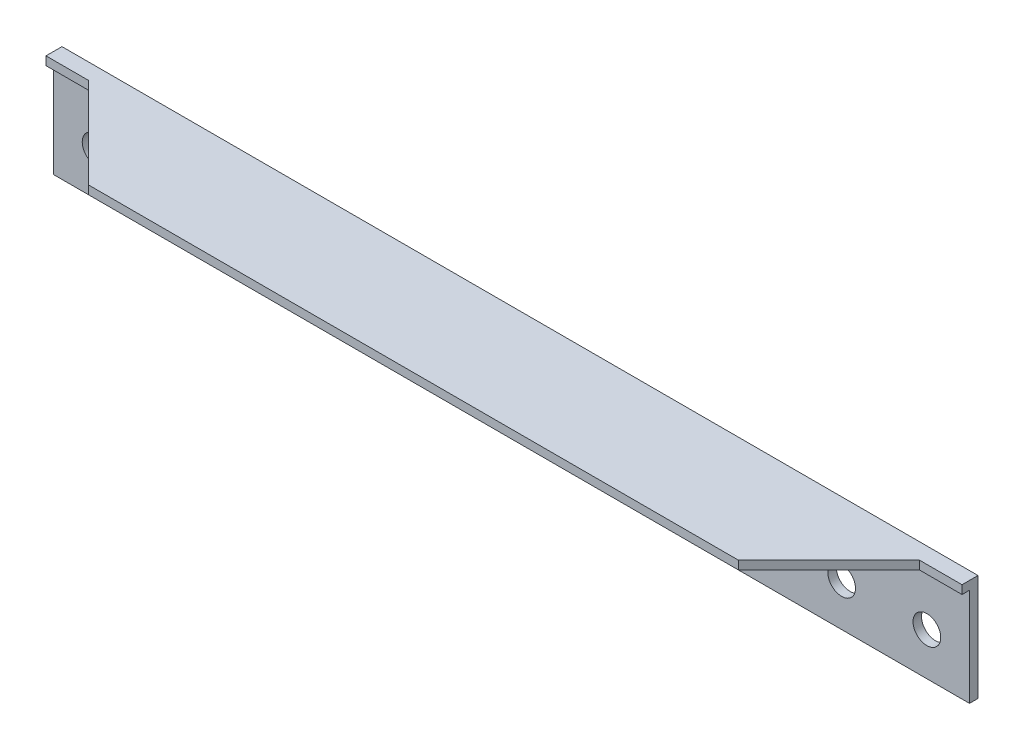
ISO-10303-21;
HEADER;
FILE_DESCRIPTION(('STEP AP214'),'2;1');
FILE_NAME('part.step','',(''),(''),'','','');
FILE_SCHEMA(('AUTOMOTIVE_DESIGN { 1 0 10303 214 1 1 1 1 }'));
ENDSEC;
DATA;
#1=APPLICATION_CONTEXT('core data for automotive mechanical design processes');
#2=APPLICATION_PROTOCOL_DEFINITION('international standard','automotive_design',2000,#1);
#3=PRODUCT_CONTEXT('',#1,'mechanical');
#4=PRODUCT('Part','Part','',(#3));
#5=PRODUCT_RELATED_PRODUCT_CATEGORY('part','',(#4));
#6=PRODUCT_DEFINITION_FORMATION('','',#4);
#7=PRODUCT_DEFINITION_CONTEXT('part definition',#1,'design');
#8=PRODUCT_DEFINITION('design','',#6,#7);
#9=PRODUCT_DEFINITION_SHAPE('','',#8);
#10=(LENGTH_UNIT() NAMED_UNIT(*) SI_UNIT(.MILLI.,.METRE.));
#11=(NAMED_UNIT(*) PLANE_ANGLE_UNIT() SI_UNIT($,.RADIAN.));
#12=(NAMED_UNIT(*) SI_UNIT($,.STERADIAN.) SOLID_ANGLE_UNIT());
#13=UNCERTAINTY_MEASURE_WITH_UNIT(LENGTH_MEASURE(1.E-05),#10,'distance_accuracy_value','');
#14=(GEOMETRIC_REPRESENTATION_CONTEXT(3) GLOBAL_UNCERTAINTY_ASSIGNED_CONTEXT((#13)) GLOBAL_UNIT_ASSIGNED_CONTEXT((#10,
#11,#12)) REPRESENTATION_CONTEXT('',''));
#15=CARTESIAN_POINT('',(0.,0.,0.));
#16=DIRECTION('',(0.,0.,1.));
#17=DIRECTION('',(1.,0.,0.));
#18=AXIS2_PLACEMENT_3D('',#15,#16,#17);
#19=CARTESIAN_POINT('',(430.,0.,8.));
#20=DIRECTION('',(-1.,0.,0.));
#21=DIRECTION('',(0.,0.,1.));
#22=AXIS2_PLACEMENT_3D('',#19,#20,#21);
#23=PLANE('',#22);
#24=DIRECTION('',(0.,1.,0.));
#25=VECTOR('',#24,1.);
#26=CARTESIAN_POINT('',(430.000000000004,-2.50000062179678E-05,15.));
#27=LINE('',#26,#25);
#28=CARTESIAN_POINT('',(430.000000000004,91.9999999999969,15.));
#29=VERTEX_POINT('',#28);
#30=CARTESIAN_POINT('',(430.000000000004,99.9999999999969,15.));
#31=VERTEX_POINT('',#30);
#32=EDGE_CURVE('E112',#29,#31,#27,.T.);
#33=ORIENTED_EDGE('',*,*,#32,.F.);
#34=DIRECTION('',(0.,0.,-1.));
#35=VECTOR('',#34,1.);
#36=CARTESIAN_POINT('',(429.999999999999,91.9999999999969,100.));
#37=LINE('',#36,#35);
#38=CARTESIAN_POINT('',(429.999999999999,91.9999999999969,8.));
#39=VERTEX_POINT('',#38);
#40=EDGE_CURVE('E195',#29,#39,#37,.T.);
#41=ORIENTED_EDGE('',*,*,#40,.T.);
#42=DIRECTION('',(0.,1.,0.));
#43=VECTOR('',#42,1.);
#44=CARTESIAN_POINT('',(430.,0.,8.));
#45=LINE('',#44,#43);
#46=CARTESIAN_POINT('',(430.,0.,8.));
#47=VERTEX_POINT('',#46);
#48=EDGE_CURVE('E139',#47,#39,#45,.T.);
#49=ORIENTED_EDGE('',*,*,#48,.F.);
#50=DIRECTION('',(0.,0.,-1.));
#51=VECTOR('',#50,1.);
#52=CARTESIAN_POINT('',(430.,0.,8.));
#53=LINE('',#52,#51);
#54=CARTESIAN_POINT('',(430.,0.,0.));
#55=VERTEX_POINT('',#54);
#56=EDGE_CURVE('E134',#47,#55,#53,.T.);
#57=ORIENTED_EDGE('',*,*,#56,.T.);
#58=DIRECTION('',(0.,1.,0.));
#59=VECTOR('',#58,1.);
#60=CARTESIAN_POINT('',(430.,0.,0.));
#61=LINE('',#60,#59);
#62=CARTESIAN_POINT('',(430.,100.,0.));
#63=VERTEX_POINT('',#62);
#64=EDGE_CURVE('E132',#55,#63,#61,.T.);
#65=ORIENTED_EDGE('',*,*,#64,.T.);
#66=DIRECTION('',(0.,0.,-1.));
#67=VECTOR('',#66,1.);
#68=CARTESIAN_POINT('',(430.,100.,8.));
#69=LINE('',#68,#67);
#70=EDGE_CURVE('E126',#31,#63,#69,.T.);
#71=ORIENTED_EDGE('',*,*,#70,.F.);
#72=EDGE_LOOP('',(#33,#41,#49,#57,#65,#71));
#73=FACE_BOUND('',#72,.T.);
#74=ADVANCED_FACE('F34',(#73),#23,.F.);
#75=CARTESIAN_POINT('',(430.,100.,8.));
#76=DIRECTION('',(0.,-1.,0.));
#77=DIRECTION('',(1.,0.,0.));
#78=AXIS2_PLACEMENT_3D('',#75,#76,#77);
#79=PLANE('',#78);
#80=DIRECTION('',(0.707106781186499,0.,-0.707106781186596));
#81=VECTOR('',#80,1.);
#82=CARTESIAN_POINT('',(389.999999999994,99.999999999997,14.9999999999932));
#83=LINE('',#82,#81);
#84=CARTESIAN_POINT('',(304.999999999999,99.9999999999969,100.));
#85=VERTEX_POINT('',#84);
#86=CARTESIAN_POINT('',(389.999999999994,99.999999999997,14.9999999999932));
#87=VERTEX_POINT('',#86);
#88=EDGE_CURVE('E49',#85,#87,#83,.T.);
#89=ORIENTED_EDGE('',*,*,#88,.T.);
#90=DIRECTION('',(1.,0.,1.70523317688477E-13));
#91=VECTOR('',#90,1.);
#92=CARTESIAN_POINT('',(430.000000000004,99.9999999999969,15.));
#93=LINE('',#92,#91);
#94=EDGE_CURVE('E116',#87,#31,#93,.T.);
#95=ORIENTED_EDGE('',*,*,#94,.T.);
#96=ORIENTED_EDGE('',*,*,#70,.T.);
#97=DIRECTION('',(-1.,0.,0.));
#98=VECTOR('',#97,1.);
#99=CARTESIAN_POINT('',(430.,100.,0.));
#100=LINE('',#99,#98);
#101=CARTESIAN_POINT('',(-430.000000000001,99.9999999999969,0.));
#102=VERTEX_POINT('',#101);
#103=EDGE_CURVE('E150',#63,#102,#100,.T.);
#104=ORIENTED_EDGE('',*,*,#103,.T.);
#105=DIRECTION('',(0.,0.,-1.));
#106=VECTOR('',#105,1.);
#107=CARTESIAN_POINT('',(-430.000000000001,99.9999999999969,8.));
#108=LINE('',#107,#106);
#109=CARTESIAN_POINT('',(-430.000000000004,99.9999999999969,15.));
#110=VERTEX_POINT('',#109);
#111=EDGE_CURVE('E135',#110,#102,#108,.T.);
#112=ORIENTED_EDGE('',*,*,#111,.F.);
#113=DIRECTION('',(-1.,0.,1.70523317688477E-13));
#114=VECTOR('',#113,1.);
#115=CARTESIAN_POINT('',(-430.000000000004,99.9999999999969,15.));
#116=LINE('',#115,#114);
#117=CARTESIAN_POINT('',(-389.999999999994,99.999999999997,14.9999999999932));
#118=VERTEX_POINT('',#117);
#119=EDGE_CURVE('E185',#118,#110,#116,.T.);
#120=ORIENTED_EDGE('',*,*,#119,.F.);
#121=DIRECTION('',(-0.707106781186499,0.,-0.707106781186596));
#122=VECTOR('',#121,1.);
#123=CARTESIAN_POINT('',(-389.999999999994,99.999999999997,14.9999999999932));
#124=LINE('',#123,#122);
#125=CARTESIAN_POINT('',(-304.999999999999,99.9999999999974,100.));
#126=VERTEX_POINT('',#125);
#127=EDGE_CURVE('E214',#126,#118,#124,.T.);
#128=ORIENTED_EDGE('',*,*,#127,.F.);
#129=DIRECTION('',(-1.,0.,0.));
#130=VECTOR('',#129,1.);
#131=CARTESIAN_POINT('',(-430.000000000001,99.9999999999969,100.));
#132=LINE('',#131,#130);
#133=EDGE_CURVE('E193',#85,#126,#132,.T.);
#134=ORIENTED_EDGE('',*,*,#133,.F.);
#135=EDGE_LOOP('',(#89,#95,#96,#104,#112,#120,#128,#134));
#136=FACE_BOUND('',#135,.T.);
#137=ADVANCED_FACE('F124',(#136),#79,.F.);
#138=CARTESIAN_POINT('',(-430.000000000001,91.9999999999969,100.));
#139=DIRECTION('',(0.,1.,0.));
#140=DIRECTION('',(0.,0.,1.));
#141=AXIS2_PLACEMENT_3D('',#138,#139,#140);
#142=PLANE('',#141);
#143=DIRECTION('',(0.707106781186499,0.,-0.707106781186596));
#144=VECTOR('',#143,1.);
#145=CARTESIAN_POINT('',(-62.4999999999507,91.9999999999969,467.5));
#146=LINE('',#145,#144);
#147=CARTESIAN_POINT('',(304.999999999999,91.9999999999969,100.));
#148=VERTEX_POINT('',#147);
#149=CARTESIAN_POINT('',(389.999999999994,91.9999999999969,14.9999999999932));
#150=VERTEX_POINT('',#149);
#151=EDGE_CURVE('E217',#148,#150,#146,.T.);
#152=ORIENTED_EDGE('',*,*,#151,.F.);
#153=DIRECTION('',(1.,0.,0.));
#154=VECTOR('',#153,1.);
#155=CARTESIAN_POINT('',(-430.000000000001,91.9999999999969,100.));
#156=LINE('',#155,#154);
#157=CARTESIAN_POINT('',(-304.999999999999,91.9999999999969,100.));
#158=VERTEX_POINT('',#157);
#159=EDGE_CURVE('E190',#158,#148,#156,.T.);
#160=ORIENTED_EDGE('',*,*,#159,.F.);
#161=DIRECTION('',(-0.707106781186499,0.,-0.707106781186596));
#162=VECTOR('',#161,1.);
#163=CARTESIAN_POINT('',(-367.499999999991,91.9999999999969,37.4999999999989));
#164=LINE('',#163,#162);
#165=CARTESIAN_POINT('',(-389.999999999994,91.9999999999969,14.9999999999932));
#166=VERTEX_POINT('',#165);
#167=EDGE_CURVE('E57',#158,#166,#164,.T.);
#168=ORIENTED_EDGE('',*,*,#167,.T.);
#169=DIRECTION('',(-1.,0.,1.70523317688477E-13));
#170=VECTOR('',#169,1.);
#171=CARTESIAN_POINT('',(-430.000000000015,91.9999999999969,15.));
#172=LINE('',#171,#170);
#173=CARTESIAN_POINT('',(-430.000000000004,91.9999999999969,15.));
#174=VERTEX_POINT('',#173);
#175=EDGE_CURVE('E208',#166,#174,#172,.T.);
#176=ORIENTED_EDGE('',*,*,#175,.T.);
#177=DIRECTION('',(0.,0.,-1.));
#178=VECTOR('',#177,1.);
#179=CARTESIAN_POINT('',(-430.000000000001,91.9999999999969,100.));
#180=LINE('',#179,#178);
#181=CARTESIAN_POINT('',(-430.000000000001,91.9999999999969,8.));
#182=VERTEX_POINT('',#181);
#183=EDGE_CURVE('E178',#174,#182,#180,.T.);
#184=ORIENTED_EDGE('',*,*,#183,.T.);
#185=DIRECTION('',(1.,0.,0.));
#186=VECTOR('',#185,1.);
#187=CARTESIAN_POINT('',(-430.000000000001,91.9999999999969,8.));
#188=LINE('',#187,#186);
#189=EDGE_CURVE('E183',#182,#39,#188,.T.);
#190=ORIENTED_EDGE('',*,*,#189,.T.);
#191=ORIENTED_EDGE('',*,*,#40,.F.);
#192=DIRECTION('',(1.,0.,1.70523317688477E-13));
#193=VECTOR('',#192,1.);
#194=CARTESIAN_POINT('',(-429.999999999986,91.9999999999969,14.9999999998534));
#195=LINE('',#194,#193);
#196=EDGE_CURVE('E11',#150,#29,#195,.T.);
#197=ORIENTED_EDGE('',*,*,#196,.F.);
#198=EDGE_LOOP('',(#152,#160,#168,#176,#184,#190,#191,#197));
#199=FACE_BOUND('',#198,.T.);
#200=ADVANCED_FACE('F224',(#199),#142,.F.);
#201=CARTESIAN_POINT('',(-430.000000000001,91.9999999999969,100.));
#202=DIRECTION('',(0.,0.,1.));
#203=DIRECTION('',(1.,0.,0.));
#204=AXIS2_PLACEMENT_3D('',#201,#202,#203);
#205=PLANE('',#204);
#206=ORIENTED_EDGE('',*,*,#159,.T.);
#207=DIRECTION('',(0.,1.,0.));
#208=VECTOR('',#207,1.);
#209=CARTESIAN_POINT('',(304.999999999999,91.9999999999942,100.));
#210=LINE('',#209,#208);
#211=EDGE_CURVE('E42',#148,#85,#210,.T.);
#212=ORIENTED_EDGE('',*,*,#211,.T.);
#213=ORIENTED_EDGE('',*,*,#133,.T.);
#214=DIRECTION('',(0.,1.,0.));
#215=VECTOR('',#214,1.);
#216=CARTESIAN_POINT('',(-304.999999999999,91.9999999999973,100.));
#217=LINE('',#216,#215);
#218=EDGE_CURVE('E145',#158,#126,#217,.T.);
#219=ORIENTED_EDGE('',*,*,#218,.F.);
#220=EDGE_LOOP('',(#206,#212,#213,#219));
#221=FACE_BOUND('',#220,.T.);
#222=ADVANCED_FACE('F255',(#221),#205,.T.);
#223=CARTESIAN_POINT('',(-430.000000000001,99.9999999999969,8.));
#224=DIRECTION('',(0.,0.,1.));
#225=DIRECTION('',(1.,0.,0.));
#226=AXIS2_PLACEMENT_3D('',#223,#224,#225);
#227=PLANE('',#226);
#228=ORIENTED_EDGE('',*,*,#189,.F.);
#229=DIRECTION('',(0.,-1.,0.));
#230=VECTOR('',#229,1.);
#231=CARTESIAN_POINT('',(-430.,-3.10862446895044E-12,8.));
#232=LINE('',#231,#230);
#233=CARTESIAN_POINT('',(-430.,-3.10862446895044E-12,8.));
#234=VERTEX_POINT('',#233);
#235=EDGE_CURVE('E146',#182,#234,#232,.T.);
#236=ORIENTED_EDGE('',*,*,#235,.T.);
#237=DIRECTION('',(1.,0.,0.));
#238=VECTOR('',#237,1.);
#239=CARTESIAN_POINT('',(-430.,-3.10862446895044E-12,8.));
#240=LINE('',#239,#238);
#241=EDGE_CURVE('E149',#234,#47,#240,.T.);
#242=ORIENTED_EDGE('',*,*,#241,.T.);
#243=ORIENTED_EDGE('',*,*,#48,.T.);
#244=EDGE_LOOP('',(#228,#236,#242,#243));
#245=FACE_BOUND('',#244,.T.);
#246=CARTESIAN_POINT('',(-389.999999999993,39.9999999999933,8.));
#247=DIRECTION('',(0.,0.,1.));
#248=DIRECTION('',(-1.,0.,0.));
#249=AXIS2_PLACEMENT_3D('',#246,#247,#248);
#250=CIRCLE('',#249,13.0000000000001);
#251=CARTESIAN_POINT('',(-402.999999999994,39.9999999999933,8.));
#252=VERTEX_POINT('',#251);
#253=EDGE_CURVE('E389',#252,#252,#250,.T.);
#254=ORIENTED_EDGE('',*,*,#253,.F.);
#255=EDGE_LOOP('',(#254));
#256=FACE_BOUND('',#255,.T.);
#257=CARTESIAN_POINT('',(389.999999999993,39.999999999996,8.));
#258=DIRECTION('',(0.,0.,1.));
#259=DIRECTION('',(1.,0.,0.));
#260=AXIS2_PLACEMENT_3D('',#257,#258,#259);
#261=CIRCLE('',#260,13.);
#262=CARTESIAN_POINT('',(402.999999999993,39.999999999996,8.));
#263=VERTEX_POINT('',#262);
#264=EDGE_CURVE('E164',#263,#263,#261,.T.);
#265=ORIENTED_EDGE('',*,*,#264,.F.);
#266=EDGE_LOOP('',(#265));
#267=FACE_BOUND('',#266,.T.);
#268=CARTESIAN_POINT('',(310.000000000001,39.999999999996,8.));
#269=DIRECTION('',(0.,0.,1.));
#270=DIRECTION('',(1.,0.,0.));
#271=AXIS2_PLACEMENT_3D('',#268,#269,#270);
#272=CIRCLE('',#271,13.);
#273=CARTESIAN_POINT('',(323.000000000001,39.999999999996,8.));
#274=VERTEX_POINT('',#273);
#275=EDGE_CURVE('E395',#274,#274,#272,.T.);
#276=ORIENTED_EDGE('',*,*,#275,.F.);
#277=EDGE_LOOP('',(#276));
#278=FACE_BOUND('',#277,.T.);
#279=CARTESIAN_POINT('',(-310.000000000001,39.9999999999937,8.));
#280=DIRECTION('',(0.,0.,1.));
#281=DIRECTION('',(-1.,0.,0.));
#282=AXIS2_PLACEMENT_3D('',#279,#280,#281);
#283=CIRCLE('',#282,13.0000000000001);
#284=CARTESIAN_POINT('',(-323.000000000002,39.9999999999937,8.));
#285=VERTEX_POINT('',#284);
#286=EDGE_CURVE('E198',#285,#285,#283,.T.);
#287=ORIENTED_EDGE('',*,*,#286,.F.);
#288=EDGE_LOOP('',(#287));
#289=FACE_BOUND('',#288,.T.);
#290=ADVANCED_FACE('F229',(#245,#256,#267,#278,#289),#227,.T.);
#291=CARTESIAN_POINT('',(-430.000000000001,99.9999999999969,0.));
#292=DIRECTION('',(0.,0.,1.));
#293=DIRECTION('',(1.,0.,0.));
#294=AXIS2_PLACEMENT_3D('',#291,#292,#293);
#295=PLANE('',#294);
#296=CARTESIAN_POINT('',(-389.999999999993,39.9999999999933,0.));
#297=DIRECTION('',(0.,0.,1.));
#298=DIRECTION('',(-1.,0.,0.));
#299=AXIS2_PLACEMENT_3D('',#296,#297,#298);
#300=CIRCLE('',#299,13.0000000000001);
#301=CARTESIAN_POINT('',(-402.999999999994,39.9999999999933,0.));
#302=VERTEX_POINT('',#301);
#303=EDGE_CURVE('E387',#302,#302,#300,.T.);
#304=ORIENTED_EDGE('',*,*,#303,.T.);
#305=EDGE_LOOP('',(#304));
#306=FACE_BOUND('',#305,.T.);
#307=CARTESIAN_POINT('',(389.999999999993,39.999999999996,0.));
#308=DIRECTION('',(0.,0.,1.));
#309=DIRECTION('',(1.,0.,0.));
#310=AXIS2_PLACEMENT_3D('',#307,#308,#309);
#311=CIRCLE('',#310,13.);
#312=CARTESIAN_POINT('',(402.999999999993,39.999999999996,0.));
#313=VERTEX_POINT('',#312);
#314=EDGE_CURVE('E156',#313,#313,#311,.T.);
#315=ORIENTED_EDGE('',*,*,#314,.T.);
#316=EDGE_LOOP('',(#315));
#317=FACE_BOUND('',#316,.T.);
#318=DIRECTION('',(0.,-1.,0.));
#319=VECTOR('',#318,1.);
#320=CARTESIAN_POINT('',(-430.,-3.10862446895044E-12,0.));
#321=LINE('',#320,#319);
#322=CARTESIAN_POINT('',(-430.,-3.10862446895044E-12,0.));
#323=VERTEX_POINT('',#322);
#324=EDGE_CURVE('E160',#102,#323,#321,.T.);
#325=ORIENTED_EDGE('',*,*,#324,.F.);
#326=ORIENTED_EDGE('',*,*,#103,.F.);
#327=ORIENTED_EDGE('',*,*,#64,.F.);
#328=DIRECTION('',(1.,0.,0.));
#329=VECTOR('',#328,1.);
#330=CARTESIAN_POINT('',(-430.,-3.10862446895044E-12,0.));
#331=LINE('',#330,#329);
#332=EDGE_CURVE('E163',#323,#55,#331,.T.);
#333=ORIENTED_EDGE('',*,*,#332,.F.);
#334=EDGE_LOOP('',(#325,#326,#327,#333));
#335=FACE_BOUND('',#334,.T.);
#336=CARTESIAN_POINT('',(310.000000000001,39.999999999996,0.));
#337=DIRECTION('',(0.,0.,1.));
#338=DIRECTION('',(1.,0.,0.));
#339=AXIS2_PLACEMENT_3D('',#336,#337,#338);
#340=CIRCLE('',#339,13.);
#341=CARTESIAN_POINT('',(323.000000000001,39.999999999996,0.));
#342=VERTEX_POINT('',#341);
#343=EDGE_CURVE('E392',#342,#342,#340,.T.);
#344=ORIENTED_EDGE('',*,*,#343,.T.);
#345=EDGE_LOOP('',(#344));
#346=FACE_BOUND('',#345,.T.);
#347=CARTESIAN_POINT('',(-310.000000000001,39.9999999999937,0.));
#348=DIRECTION('',(0.,0.,1.));
#349=DIRECTION('',(-1.,0.,0.));
#350=AXIS2_PLACEMENT_3D('',#347,#348,#349);
#351=CIRCLE('',#350,13.0000000000001);
#352=CARTESIAN_POINT('',(-323.000000000002,39.9999999999937,0.));
#353=VERTEX_POINT('',#352);
#354=EDGE_CURVE('E210',#353,#353,#351,.T.);
#355=ORIENTED_EDGE('',*,*,#354,.T.);
#356=EDGE_LOOP('',(#355));
#357=FACE_BOUND('',#356,.T.);
#358=ADVANCED_FACE('F170',(#306,#317,#335,#346,#357),#295,.F.);
#359=CARTESIAN_POINT('',(-430.,-3.10862446895044E-12,8.));
#360=DIRECTION('',(1.,0.,0.));
#361=DIRECTION('',(0.,1.,0.));
#362=AXIS2_PLACEMENT_3D('',#359,#360,#361);
#363=PLANE('',#362);
#364=ORIENTED_EDGE('',*,*,#183,.F.);
#365=DIRECTION('',(0.,1.,0.));
#366=VECTOR('',#365,1.);
#367=CARTESIAN_POINT('',(-430.000000000004,-2.50000062179678E-05,15.));
#368=LINE('',#367,#366);
#369=EDGE_CURVE('E177',#174,#110,#368,.T.);
#370=ORIENTED_EDGE('',*,*,#369,.T.);
#371=ORIENTED_EDGE('',*,*,#111,.T.);
#372=ORIENTED_EDGE('',*,*,#324,.T.);
#373=DIRECTION('',(0.,0.,-1.));
#374=VECTOR('',#373,1.);
#375=CARTESIAN_POINT('',(-430.,-3.10862446895044E-12,8.));
#376=LINE('',#375,#374);
#377=EDGE_CURVE('E137',#234,#323,#376,.T.);
#378=ORIENTED_EDGE('',*,*,#377,.F.);
#379=ORIENTED_EDGE('',*,*,#235,.F.);
#380=EDGE_LOOP('',(#364,#370,#371,#372,#378,#379));
#381=FACE_BOUND('',#380,.T.);
#382=ADVANCED_FACE('F36',(#381),#363,.F.);
#383=CARTESIAN_POINT('',(-430.,-3.10862446895044E-12,8.));
#384=DIRECTION('',(0.,1.,0.));
#385=DIRECTION('',(-1.,0.,0.));
#386=AXIS2_PLACEMENT_3D('',#383,#384,#385);
#387=PLANE('',#386);
#388=ORIENTED_EDGE('',*,*,#332,.T.);
#389=ORIENTED_EDGE('',*,*,#56,.F.);
#390=ORIENTED_EDGE('',*,*,#241,.F.);
#391=ORIENTED_EDGE('',*,*,#377,.T.);
#392=EDGE_LOOP('',(#388,#389,#390,#391));
#393=FACE_BOUND('',#392,.T.);
#394=ADVANCED_FACE('F234',(#393),#387,.F.);
#395=CARTESIAN_POINT('',(389.999999999993,39.999999999996,8.));
#396=DIRECTION('',(0.,0.,-1.));
#397=DIRECTION('',(-1.,0.,0.));
#398=AXIS2_PLACEMENT_3D('',#395,#396,#397);
#399=CYLINDRICAL_SURFACE('',#398,13.);
#400=ORIENTED_EDGE('',*,*,#264,.T.);
#401=EDGE_LOOP('',(#400));
#402=FACE_BOUND('',#401,.T.);
#403=ORIENTED_EDGE('',*,*,#314,.F.);
#404=EDGE_LOOP('',(#403));
#405=FACE_BOUND('',#404,.T.);
#406=ADVANCED_FACE('F236',(#402,#405),#399,.F.);
#407=CARTESIAN_POINT('',(310.000000000001,39.999999999996,8.));
#408=DIRECTION('',(0.,0.,-1.));
#409=DIRECTION('',(-1.,0.,0.));
#410=AXIS2_PLACEMENT_3D('',#407,#408,#409);
#411=CYLINDRICAL_SURFACE('',#410,13.);
#412=ORIENTED_EDGE('',*,*,#275,.T.);
#413=EDGE_LOOP('',(#412));
#414=FACE_BOUND('',#413,.T.);
#415=ORIENTED_EDGE('',*,*,#343,.F.);
#416=EDGE_LOOP('',(#415));
#417=FACE_BOUND('',#416,.T.);
#418=ADVANCED_FACE('F241',(#414,#417),#411,.F.);
#419=CARTESIAN_POINT('',(-389.999999999993,39.9999999999933,8.));
#420=DIRECTION('',(0.,0.,-1.));
#421=DIRECTION('',(-1.,0.,0.));
#422=AXIS2_PLACEMENT_3D('',#419,#420,#421);
#423=CYLINDRICAL_SURFACE('',#422,13.0000000000001);
#424=ORIENTED_EDGE('',*,*,#253,.T.);
#425=EDGE_LOOP('',(#424));
#426=FACE_BOUND('',#425,.T.);
#427=ORIENTED_EDGE('',*,*,#303,.F.);
#428=EDGE_LOOP('',(#427));
#429=FACE_BOUND('',#428,.T.);
#430=ADVANCED_FACE('F259',(#426,#429),#423,.F.);
#431=CARTESIAN_POINT('',(-310.000000000001,39.9999999999937,8.));
#432=DIRECTION('',(0.,0.,-1.));
#433=DIRECTION('',(-1.,0.,0.));
#434=AXIS2_PLACEMENT_3D('',#431,#432,#433);
#435=CYLINDRICAL_SURFACE('',#434,13.0000000000001);
#436=ORIENTED_EDGE('',*,*,#286,.T.);
#437=EDGE_LOOP('',(#436));
#438=FACE_BOUND('',#437,.T.);
#439=ORIENTED_EDGE('',*,*,#354,.F.);
#440=EDGE_LOOP('',(#439));
#441=FACE_BOUND('',#440,.T.);
#442=ADVANCED_FACE('F263',(#438,#441),#435,.F.);
#443=CARTESIAN_POINT('',(-430.000000000004,-2.50000062179678E-05,15.));
#444=DIRECTION('',(-1.70523317688477E-13,0.,-1.));
#445=DIRECTION('',(-1.,0.,1.70523317688477E-13));
#446=AXIS2_PLACEMENT_3D('',#443,#444,#445);
#447=PLANE('',#446);
#448=DIRECTION('',(0.,1.,0.));
#449=VECTOR('',#448,1.);
#450=CARTESIAN_POINT('',(-389.999999999993,-2.500000607919E-05,14.9999999999932));
#451=LINE('',#450,#449);
#452=EDGE_CURVE('E181',#166,#118,#451,.T.);
#453=ORIENTED_EDGE('',*,*,#452,.T.);
#454=ORIENTED_EDGE('',*,*,#119,.T.);
#455=ORIENTED_EDGE('',*,*,#369,.F.);
#456=ORIENTED_EDGE('',*,*,#175,.F.);
#457=EDGE_LOOP('',(#453,#454,#455,#456));
#458=FACE_BOUND('',#457,.T.);
#459=ADVANCED_FACE('F267',(#458),#447,.F.);
#460=CARTESIAN_POINT('',(-389.999999999993,-2.500000607919E-05,14.9999999999932));
#461=DIRECTION('',(0.707106781186596,0.,-0.707106781186499));
#462=DIRECTION('',(-0.707106781186499,0.,-0.707106781186596));
#463=AXIS2_PLACEMENT_3D('',#460,#461,#462);
#464=PLANE('',#463);
#465=ORIENTED_EDGE('',*,*,#218,.T.);
#466=ORIENTED_EDGE('',*,*,#127,.T.);
#467=ORIENTED_EDGE('',*,*,#452,.F.);
#468=ORIENTED_EDGE('',*,*,#167,.F.);
#469=EDGE_LOOP('',(#465,#466,#467,#468));
#470=FACE_BOUND('',#469,.T.);
#471=ADVANCED_FACE('F213',(#470),#464,.F.);
#472=CARTESIAN_POINT('',(430.000000000004,-2.50000062179678E-05,15.));
#473=DIRECTION('',(-1.70523317688477E-13,0.,1.));
#474=DIRECTION('',(1.,0.,1.70523317688477E-13));
#475=AXIS2_PLACEMENT_3D('',#472,#473,#474);
#476=PLANE('',#475);
#477=ORIENTED_EDGE('',*,*,#196,.T.);
#478=ORIENTED_EDGE('',*,*,#32,.T.);
#479=ORIENTED_EDGE('',*,*,#94,.F.);
#480=DIRECTION('',(0.,1.,0.));
#481=VECTOR('',#480,1.);
#482=CARTESIAN_POINT('',(389.999999999993,-2.500000607919E-05,14.9999999999932));
#483=LINE('',#482,#481);
#484=EDGE_CURVE('E121',#150,#87,#483,.T.);
#485=ORIENTED_EDGE('',*,*,#484,.F.);
#486=EDGE_LOOP('',(#477,#478,#479,#485));
#487=FACE_BOUND('',#486,.T.);
#488=ADVANCED_FACE('F114',(#487),#476,.T.);
#489=CARTESIAN_POINT('',(389.999999999993,-2.500000607919E-05,14.9999999999932));
#490=DIRECTION('',(0.707106781186596,0.,0.707106781186499));
#491=DIRECTION('',(0.707106781186499,0.,-0.707106781186596));
#492=AXIS2_PLACEMENT_3D('',#489,#490,#491);
#493=PLANE('',#492);
#494=ORIENTED_EDGE('',*,*,#151,.T.);
#495=ORIENTED_EDGE('',*,*,#484,.T.);
#496=ORIENTED_EDGE('',*,*,#88,.F.);
#497=ORIENTED_EDGE('',*,*,#211,.F.);
#498=EDGE_LOOP('',(#494,#495,#496,#497));
#499=FACE_BOUND('',#498,.T.);
#500=ADVANCED_FACE('F221',(#499),#493,.T.);
#501=CLOSED_SHELL('',(#74,#137,#200,#222,#290,#358,#382,#394,#406,#418,#430,#442,#459,#471,#488,#500));
#502=MANIFOLD_SOLID_BREP('B2',#501);
#503=ADVANCED_BREP_SHAPE_REPRESENTATION('',(#18,#502),#14);
#504=SHAPE_DEFINITION_REPRESENTATION(#9,#503);
ENDSEC;
END-ISO-10303-21;
